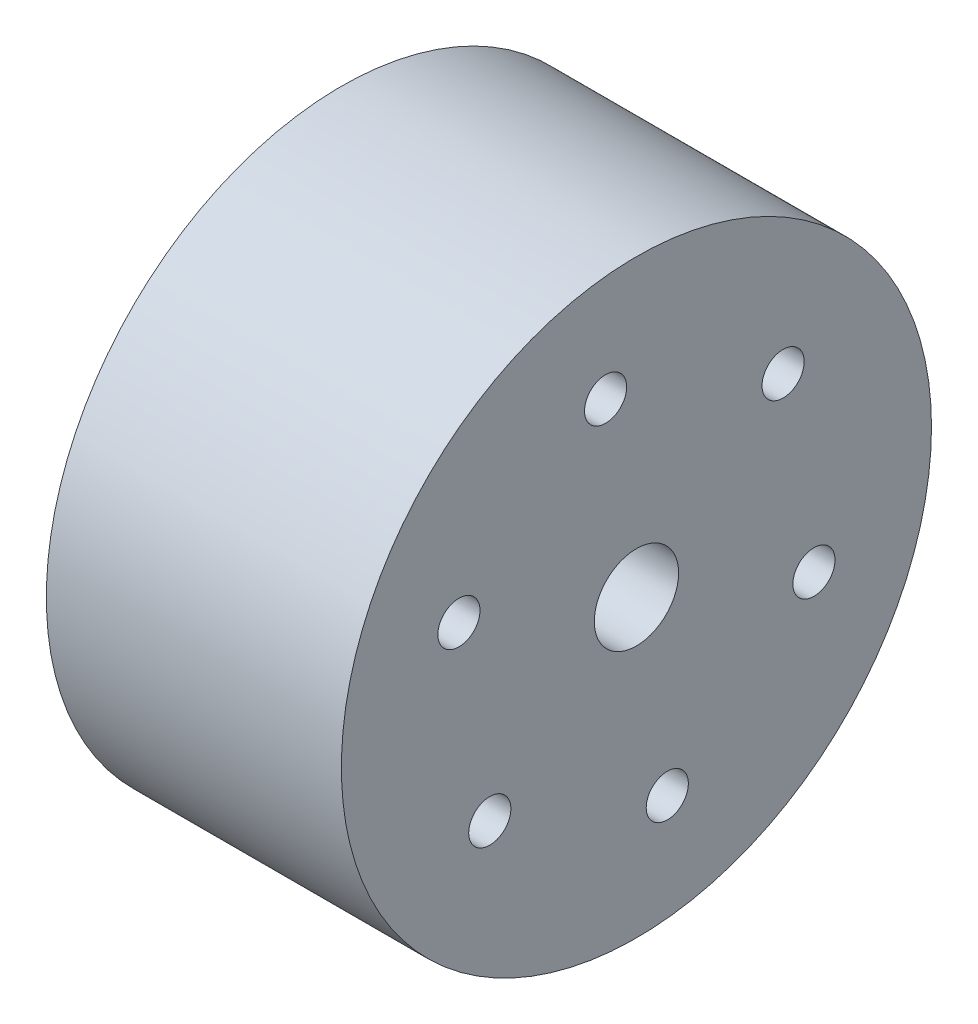
ISO-10303-21;
HEADER;
FILE_DESCRIPTION(('STEP AP214'),'2;1');
FILE_NAME('part.step','',(''),(''),'','','');
FILE_SCHEMA(('AUTOMOTIVE_DESIGN { 1 0 10303 214 1 1 1 1 }'));
ENDSEC;
DATA;
#1=APPLICATION_CONTEXT('core data for automotive mechanical design processes');
#2=APPLICATION_PROTOCOL_DEFINITION('international standard','automotive_design',2000,#1);
#3=PRODUCT_CONTEXT('',#1,'mechanical');
#4=PRODUCT('Part','Part','',(#3));
#5=PRODUCT_RELATED_PRODUCT_CATEGORY('part','',(#4));
#6=PRODUCT_DEFINITION_FORMATION('','',#4);
#7=PRODUCT_DEFINITION_CONTEXT('part definition',#1,'design');
#8=PRODUCT_DEFINITION('design','',#6,#7);
#9=PRODUCT_DEFINITION_SHAPE('','',#8);
#10=(LENGTH_UNIT() NAMED_UNIT(*) SI_UNIT(.MILLI.,.METRE.));
#11=(NAMED_UNIT(*) PLANE_ANGLE_UNIT() SI_UNIT($,.RADIAN.));
#12=(NAMED_UNIT(*) SI_UNIT($,.STERADIAN.) SOLID_ANGLE_UNIT());
#13=UNCERTAINTY_MEASURE_WITH_UNIT(LENGTH_MEASURE(1.E-05),#10,'distance_accuracy_value','');
#14=(GEOMETRIC_REPRESENTATION_CONTEXT(3) GLOBAL_UNCERTAINTY_ASSIGNED_CONTEXT((#13)) GLOBAL_UNIT_ASSIGNED_CONTEXT((#10,
#11,#12)) REPRESENTATION_CONTEXT('',''));
#15=CARTESIAN_POINT('',(0.,0.,0.));
#16=DIRECTION('',(0.,0.,1.));
#17=DIRECTION('',(1.,0.,0.));
#18=AXIS2_PLACEMENT_3D('',#15,#16,#17);
#19=CARTESIAN_POINT('',(0.,0.,0.));
#20=DIRECTION('',(1.,0.,0.));
#21=DIRECTION('',(0.,0.,-1.));
#22=AXIS2_PLACEMENT_3D('',#19,#20,#21);
#23=CYLINDRICAL_SURFACE('',#22,35.0000000000008);
#24=CARTESIAN_POINT('',(-38.7161487725197,0.,0.));
#25=DIRECTION('',(1.,0.,0.));
#26=DIRECTION('',(0.,0.,-1.));
#27=AXIS2_PLACEMENT_3D('',#24,#25,#26);
#28=CIRCLE('',#27,35.0000000000008);
#29=CARTESIAN_POINT('',(-38.7161487725197,0.,-35.0000000000008));
#30=VERTEX_POINT('',#29);
#31=EDGE_CURVE('E10',#30,#30,#28,.T.);
#32=ORIENTED_EDGE('',*,*,#31,.T.);
#33=EDGE_LOOP('',(#32));
#34=FACE_BOUND('',#33,.T.);
#35=CARTESIAN_POINT('',(-3.7161487725197,0.,0.));
#36=DIRECTION('',(1.,0.,0.));
#37=DIRECTION('',(0.,0.,-1.));
#38=AXIS2_PLACEMENT_3D('',#35,#36,#37);
#39=CIRCLE('',#38,35.0000000000008);
#40=CARTESIAN_POINT('',(-3.7161487725197,0.,-35.0000000000008));
#41=VERTEX_POINT('',#40);
#42=EDGE_CURVE('E56',#41,#41,#39,.T.);
#43=ORIENTED_EDGE('',*,*,#42,.F.);
#44=EDGE_LOOP('',(#43));
#45=FACE_BOUND('',#44,.T.);
#46=ADVANCED_FACE('F34',(#34,#45),#23,.T.);
#47=CARTESIAN_POINT('',(-38.7161487725197,35.0000000000008,0.));
#48=DIRECTION('',(-1.,0.,0.));
#49=DIRECTION('',(0.,0.,1.));
#50=AXIS2_PLACEMENT_3D('',#47,#48,#49);
#51=PLANE('',#50);
#52=CARTESIAN_POINT('',(-38.7161487725197,22.200474387253,3.65908963827641));
#53=DIRECTION('',(-1.,0.,0.));
#54=DIRECTION('',(0.,0.,1.));
#55=AXIS2_PLACEMENT_3D('',#52,#53,#54);
#56=CIRCLE('',#55,2.50000000000021);
#57=CARTESIAN_POINT('',(-38.7161487725197,22.200474387253,6.15908963827662));
#58=VERTEX_POINT('',#57);
#59=EDGE_CURVE('E70',#58,#58,#56,.T.);
#60=ORIENTED_EDGE('',*,*,#59,.F.);
#61=EDGE_LOOP('',(#60));
#62=FACE_BOUND('',#61,.T.);
#63=CARTESIAN_POINT('',(-38.7161487725197,14.2691017750983,-17.3966299762887));
#64=DIRECTION('',(-1.,0.,0.));
#65=DIRECTION('',(0.,0.,1.));
#66=AXIS2_PLACEMENT_3D('',#63,#64,#65);
#67=CIRCLE('',#66,2.50000000000061);
#68=CARTESIAN_POINT('',(-38.7161487725197,14.2691017750983,-14.8966299762881));
#69=VERTEX_POINT('',#68);
#70=EDGE_CURVE('E69',#69,#69,#67,.T.);
#71=ORIENTED_EDGE('',*,*,#70,.F.);
#72=EDGE_LOOP('',(#71));
#73=FACE_BOUND('',#72,.T.);
#74=CARTESIAN_POINT('',(-38.7161487725197,-7.93137261215471,-21.0557196145651));
#75=DIRECTION('',(-1.,0.,0.));
#76=DIRECTION('',(0.,0.,1.));
#77=AXIS2_PLACEMENT_3D('',#74,#75,#76);
#78=CIRCLE('',#77,2.5000000000004);
#79=CARTESIAN_POINT('',(-38.7161487725197,-7.93137261215471,-18.5557196145647));
#80=VERTEX_POINT('',#79);
#81=EDGE_CURVE('E76',#80,#80,#78,.T.);
#82=ORIENTED_EDGE('',*,*,#81,.F.);
#83=EDGE_LOOP('',(#82));
#84=FACE_BOUND('',#83,.T.);
#85=CARTESIAN_POINT('',(-38.7161487725197,-22.200474387253,-3.65908963827642));
#86=DIRECTION('',(-1.,0.,0.));
#87=DIRECTION('',(0.,0.,1.));
#88=AXIS2_PLACEMENT_3D('',#85,#86,#87);
#89=CIRCLE('',#88,2.49999999999979);
#90=CARTESIAN_POINT('',(-38.7161487725197,-22.200474387253,-1.15908963827664));
#91=VERTEX_POINT('',#90);
#92=EDGE_CURVE('E82',#91,#91,#89,.T.);
#93=ORIENTED_EDGE('',*,*,#92,.F.);
#94=EDGE_LOOP('',(#93));
#95=FACE_BOUND('',#94,.T.);
#96=CARTESIAN_POINT('',(-38.7161487725197,-14.2691017750983,17.3966299762887));
#97=DIRECTION('',(-1.,0.,0.));
#98=DIRECTION('',(0.,0.,1.));
#99=AXIS2_PLACEMENT_3D('',#96,#97,#98);
#100=CIRCLE('',#99,2.49999999999939);
#101=CARTESIAN_POINT('',(-38.7161487725197,-14.2691017750983,19.8966299762881));
#102=VERTEX_POINT('',#101);
#103=EDGE_CURVE('E88',#102,#102,#100,.T.);
#104=ORIENTED_EDGE('',*,*,#103,.F.);
#105=EDGE_LOOP('',(#104));
#106=FACE_BOUND('',#105,.T.);
#107=CARTESIAN_POINT('',(-38.7161487725197,7.93137261215471,21.0557196145651));
#108=DIRECTION('',(-1.,0.,0.));
#109=DIRECTION('',(0.,0.,1.));
#110=AXIS2_PLACEMENT_3D('',#107,#108,#109);
#111=CIRCLE('',#110,2.4999999999996);
#112=CARTESIAN_POINT('',(-38.7161487725197,7.93137261215471,23.5557196145647));
#113=VERTEX_POINT('',#112);
#114=EDGE_CURVE('E62',#113,#113,#111,.T.);
#115=ORIENTED_EDGE('',*,*,#114,.F.);
#116=EDGE_LOOP('',(#115));
#117=FACE_BOUND('',#116,.T.);
#118=CARTESIAN_POINT('',(-38.7161487725197,0.,0.));
#119=DIRECTION('',(1.,0.,0.));
#120=DIRECTION('',(0.,0.,-1.));
#121=AXIS2_PLACEMENT_3D('',#118,#119,#120);
#122=CIRCLE('',#121,16.);
#123=CARTESIAN_POINT('',(-38.7161487725197,0.,-16.));
#124=VERTEX_POINT('',#123);
#125=EDGE_CURVE('E40',#124,#124,#122,.T.);
#126=ORIENTED_EDGE('',*,*,#125,.T.);
#127=EDGE_LOOP('',(#126));
#128=FACE_BOUND('',#127,.T.);
#129=ORIENTED_EDGE('',*,*,#31,.F.);
#130=EDGE_LOOP('',(#129));
#131=FACE_BOUND('',#130,.T.);
#132=ADVANCED_FACE('F99',(#62,#73,#84,#95,#106,#117,#128,#131),#51,.T.);
#133=CARTESIAN_POINT('',(0.,0.,0.));
#134=DIRECTION('',(1.,0.,0.));
#135=DIRECTION('',(0.,0.,-1.));
#136=AXIS2_PLACEMENT_3D('',#133,#134,#135);
#137=CYLINDRICAL_SURFACE('',#136,16.);
#138=CARTESIAN_POINT('',(-33.7161487725197,0.,0.));
#139=DIRECTION('',(1.,0.,0.));
#140=DIRECTION('',(0.,0.,-1.));
#141=AXIS2_PLACEMENT_3D('',#138,#139,#140);
#142=CIRCLE('',#141,16.);
#143=CARTESIAN_POINT('',(-33.7161487725197,0.,-16.));
#144=VERTEX_POINT('',#143);
#145=EDGE_CURVE('E44',#144,#144,#142,.T.);
#146=ORIENTED_EDGE('',*,*,#145,.T.);
#147=EDGE_LOOP('',(#146));
#148=FACE_BOUND('',#147,.T.);
#149=ORIENTED_EDGE('',*,*,#125,.F.);
#150=EDGE_LOOP('',(#149));
#151=FACE_BOUND('',#150,.T.);
#152=ADVANCED_FACE('F102',(#148,#151),#137,.F.);
#153=CARTESIAN_POINT('',(-33.7161487725197,16.,0.));
#154=DIRECTION('',(-1.,0.,0.));
#155=DIRECTION('',(0.,0.,1.));
#156=AXIS2_PLACEMENT_3D('',#153,#154,#155);
#157=PLANE('',#156);
#158=CARTESIAN_POINT('',(-33.7161487725197,0.,0.));
#159=DIRECTION('',(1.,0.,0.));
#160=DIRECTION('',(0.,0.,-1.));
#161=AXIS2_PLACEMENT_3D('',#158,#159,#160);
#162=CIRCLE('',#161,5.00000000000077);
#163=CARTESIAN_POINT('',(-33.7161487725197,0.,-5.00000000000077));
#164=VERTEX_POINT('',#163);
#165=EDGE_CURVE('E48',#164,#164,#162,.T.);
#166=ORIENTED_EDGE('',*,*,#165,.T.);
#167=EDGE_LOOP('',(#166));
#168=FACE_BOUND('',#167,.T.);
#169=ORIENTED_EDGE('',*,*,#145,.F.);
#170=EDGE_LOOP('',(#169));
#171=FACE_BOUND('',#170,.T.);
#172=ADVANCED_FACE('F125',(#168,#171),#157,.T.);
#173=CARTESIAN_POINT('',(0.,0.,0.));
#174=DIRECTION('',(1.,0.,0.));
#175=DIRECTION('',(0.,0.,-1.));
#176=AXIS2_PLACEMENT_3D('',#173,#174,#175);
#177=CYLINDRICAL_SURFACE('',#176,5.0000000000006);
#178=CARTESIAN_POINT('',(-3.7161487725197,0.,0.));
#179=DIRECTION('',(1.,0.,0.));
#180=DIRECTION('',(0.,0.,-1.));
#181=AXIS2_PLACEMENT_3D('',#178,#179,#180);
#182=CIRCLE('',#181,5.00000000000043);
#183=CARTESIAN_POINT('',(-3.7161487725197,0.,-5.00000000000043));
#184=VERTEX_POINT('',#183);
#185=EDGE_CURVE('E53',#184,#184,#182,.T.);
#186=ORIENTED_EDGE('',*,*,#185,.T.);
#187=EDGE_LOOP('',(#186));
#188=FACE_BOUND('',#187,.T.);
#189=ORIENTED_EDGE('',*,*,#165,.F.);
#190=EDGE_LOOP('',(#189));
#191=FACE_BOUND('',#190,.T.);
#192=ADVANCED_FACE('F116',(#188,#191),#177,.F.);
#193=CARTESIAN_POINT('',(-3.7161487725197,5.00000000000043,0.));
#194=DIRECTION('',(1.,0.,0.));
#195=DIRECTION('',(0.,0.,-1.));
#196=AXIS2_PLACEMENT_3D('',#193,#194,#195);
#197=PLANE('',#196);
#198=CARTESIAN_POINT('',(-3.7161487725197,22.200474387253,3.65908963827641));
#199=DIRECTION('',(1.,0.,0.));
#200=DIRECTION('',(0.,0.,-1.));
#201=AXIS2_PLACEMENT_3D('',#198,#199,#200);
#202=CIRCLE('',#201,2.50000000000021);
#203=CARTESIAN_POINT('',(-3.7161487725197,22.200474387253,1.1590896382762));
#204=VERTEX_POINT('',#203);
#205=EDGE_CURVE('E66',#204,#204,#202,.F.);
#206=ORIENTED_EDGE('',*,*,#205,.T.);
#207=EDGE_LOOP('',(#206));
#208=FACE_BOUND('',#207,.T.);
#209=CARTESIAN_POINT('',(-3.7161487725197,14.2691017750983,-17.3966299762887));
#210=DIRECTION('',(1.,0.,0.));
#211=DIRECTION('',(0.,0.,-1.));
#212=AXIS2_PLACEMENT_3D('',#209,#210,#211);
#213=CIRCLE('',#212,2.50000000000061);
#214=CARTESIAN_POINT('',(-3.7161487725197,14.2691017750983,-19.8966299762893));
#215=VERTEX_POINT('',#214);
#216=EDGE_CURVE('E73',#215,#215,#213,.F.);
#217=ORIENTED_EDGE('',*,*,#216,.T.);
#218=EDGE_LOOP('',(#217));
#219=FACE_BOUND('',#218,.T.);
#220=CARTESIAN_POINT('',(-3.7161487725197,-7.93137261215471,-21.0557196145651));
#221=DIRECTION('',(1.,0.,0.));
#222=DIRECTION('',(0.,0.,-1.));
#223=AXIS2_PLACEMENT_3D('',#220,#221,#222);
#224=CIRCLE('',#223,2.5000000000004);
#225=CARTESIAN_POINT('',(-3.7161487725197,-7.93137261215471,-23.5557196145655));
#226=VERTEX_POINT('',#225);
#227=EDGE_CURVE('E79',#226,#226,#224,.F.);
#228=ORIENTED_EDGE('',*,*,#227,.T.);
#229=EDGE_LOOP('',(#228));
#230=FACE_BOUND('',#229,.T.);
#231=CARTESIAN_POINT('',(-3.7161487725197,-22.200474387253,-3.65908963827642));
#232=DIRECTION('',(1.,0.,0.));
#233=DIRECTION('',(0.,0.,-1.));
#234=AXIS2_PLACEMENT_3D('',#231,#232,#233);
#235=CIRCLE('',#234,2.49999999999979);
#236=CARTESIAN_POINT('',(-3.7161487725197,-22.200474387253,-6.15908963827621));
#237=VERTEX_POINT('',#236);
#238=EDGE_CURVE('E85',#237,#237,#235,.F.);
#239=ORIENTED_EDGE('',*,*,#238,.T.);
#240=EDGE_LOOP('',(#239));
#241=FACE_BOUND('',#240,.T.);
#242=CARTESIAN_POINT('',(-3.7161487725197,-14.2691017750983,17.3966299762887));
#243=DIRECTION('',(1.,0.,0.));
#244=DIRECTION('',(0.,0.,-1.));
#245=AXIS2_PLACEMENT_3D('',#242,#243,#244);
#246=CIRCLE('',#245,2.49999999999939);
#247=CARTESIAN_POINT('',(-3.7161487725197,-14.2691017750983,14.8966299762893));
#248=VERTEX_POINT('',#247);
#249=EDGE_CURVE('E65',#248,#248,#246,.F.);
#250=ORIENTED_EDGE('',*,*,#249,.T.);
#251=EDGE_LOOP('',(#250));
#252=FACE_BOUND('',#251,.T.);
#253=CARTESIAN_POINT('',(-3.7161487725197,7.93137261215471,21.0557196145651));
#254=DIRECTION('',(1.,0.,0.));
#255=DIRECTION('',(0.,0.,-1.));
#256=AXIS2_PLACEMENT_3D('',#253,#254,#255);
#257=CIRCLE('',#256,2.4999999999996);
#258=CARTESIAN_POINT('',(-3.7161487725197,7.93137261215471,18.5557196145655));
#259=VERTEX_POINT('',#258);
#260=EDGE_CURVE('E59',#259,#259,#257,.F.);
#261=ORIENTED_EDGE('',*,*,#260,.T.);
#262=EDGE_LOOP('',(#261));
#263=FACE_BOUND('',#262,.T.);
#264=ORIENTED_EDGE('',*,*,#42,.T.);
#265=EDGE_LOOP('',(#264));
#266=FACE_BOUND('',#265,.T.);
#267=ORIENTED_EDGE('',*,*,#185,.F.);
#268=EDGE_LOOP('',(#267));
#269=FACE_BOUND('',#268,.T.);
#270=ADVANCED_FACE('F110',(#208,#219,#230,#241,#252,#263,#266,#269),#197,.T.);
#271=CARTESIAN_POINT('',(3.35491903934748,7.93137261215471,21.0557196145651));
#272=DIRECTION('',(-1.,0.,0.));
#273=DIRECTION('',(0.,0.,1.));
#274=AXIS2_PLACEMENT_3D('',#271,#272,#273);
#275=CYLINDRICAL_SURFACE('',#274,2.4999999999996);
#276=ORIENTED_EDGE('',*,*,#114,.T.);
#277=EDGE_LOOP('',(#276));
#278=FACE_BOUND('',#277,.T.);
#279=ORIENTED_EDGE('',*,*,#260,.F.);
#280=EDGE_LOOP('',(#279));
#281=FACE_BOUND('',#280,.T.);
#282=ADVANCED_FACE('F107',(#278,#281),#275,.F.);
#283=CARTESIAN_POINT('',(3.35491903934748,-14.2691017750983,17.3966299762887));
#284=DIRECTION('',(-1.,0.,0.));
#285=DIRECTION('',(0.,0.,1.));
#286=AXIS2_PLACEMENT_3D('',#283,#284,#285);
#287=CYLINDRICAL_SURFACE('',#286,2.49999999999939);
#288=ORIENTED_EDGE('',*,*,#103,.T.);
#289=EDGE_LOOP('',(#288));
#290=FACE_BOUND('',#289,.T.);
#291=ORIENTED_EDGE('',*,*,#249,.F.);
#292=EDGE_LOOP('',(#291));
#293=FACE_BOUND('',#292,.T.);
#294=ADVANCED_FACE('F96',(#290,#293),#287,.F.);
#295=CARTESIAN_POINT('',(3.35491903934748,-22.200474387253,-3.65908963827642));
#296=DIRECTION('',(-1.,0.,0.));
#297=DIRECTION('',(0.,0.,1.));
#298=AXIS2_PLACEMENT_3D('',#295,#296,#297);
#299=CYLINDRICAL_SURFACE('',#298,2.49999999999979);
#300=ORIENTED_EDGE('',*,*,#92,.T.);
#301=EDGE_LOOP('',(#300));
#302=FACE_BOUND('',#301,.T.);
#303=ORIENTED_EDGE('',*,*,#238,.F.);
#304=EDGE_LOOP('',(#303));
#305=FACE_BOUND('',#304,.T.);
#306=ADVANCED_FACE('F173',(#302,#305),#299,.F.);
#307=CARTESIAN_POINT('',(3.35491903934748,-7.93137261215471,-21.0557196145651));
#308=DIRECTION('',(-1.,0.,0.));
#309=DIRECTION('',(0.,0.,1.));
#310=AXIS2_PLACEMENT_3D('',#307,#308,#309);
#311=CYLINDRICAL_SURFACE('',#310,2.5000000000004);
#312=ORIENTED_EDGE('',*,*,#81,.T.);
#313=EDGE_LOOP('',(#312));
#314=FACE_BOUND('',#313,.T.);
#315=ORIENTED_EDGE('',*,*,#227,.F.);
#316=EDGE_LOOP('',(#315));
#317=FACE_BOUND('',#316,.T.);
#318=ADVANCED_FACE('F182',(#314,#317),#311,.F.);
#319=CARTESIAN_POINT('',(3.35491903934748,14.2691017750983,-17.3966299762887));
#320=DIRECTION('',(-1.,0.,0.));
#321=DIRECTION('',(0.,0.,1.));
#322=AXIS2_PLACEMENT_3D('',#319,#320,#321);
#323=CYLINDRICAL_SURFACE('',#322,2.50000000000061);
#324=ORIENTED_EDGE('',*,*,#70,.T.);
#325=EDGE_LOOP('',(#324));
#326=FACE_BOUND('',#325,.T.);
#327=ORIENTED_EDGE('',*,*,#216,.F.);
#328=EDGE_LOOP('',(#327));
#329=FACE_BOUND('',#328,.T.);
#330=ADVANCED_FACE('F192',(#326,#329),#323,.F.);
#331=CARTESIAN_POINT('',(3.35491903934748,22.200474387253,3.65908963827641));
#332=DIRECTION('',(-1.,0.,0.));
#333=DIRECTION('',(0.,0.,1.));
#334=AXIS2_PLACEMENT_3D('',#331,#332,#333);
#335=CYLINDRICAL_SURFACE('',#334,2.50000000000021);
#336=ORIENTED_EDGE('',*,*,#59,.T.);
#337=EDGE_LOOP('',(#336));
#338=FACE_BOUND('',#337,.T.);
#339=ORIENTED_EDGE('',*,*,#205,.F.);
#340=EDGE_LOOP('',(#339));
#341=FACE_BOUND('',#340,.T.);
#342=ADVANCED_FACE('F202',(#338,#341),#335,.F.);
#343=CLOSED_SHELL('',(#46,#132,#152,#172,#192,#270,#282,#294,#306,#318,#330,#342));
#344=MANIFOLD_SOLID_BREP('B2',#343);
#345=ADVANCED_BREP_SHAPE_REPRESENTATION('',(#18,#344),#14);
#346=SHAPE_DEFINITION_REPRESENTATION(#9,#345);
ENDSEC;
END-ISO-10303-21;
